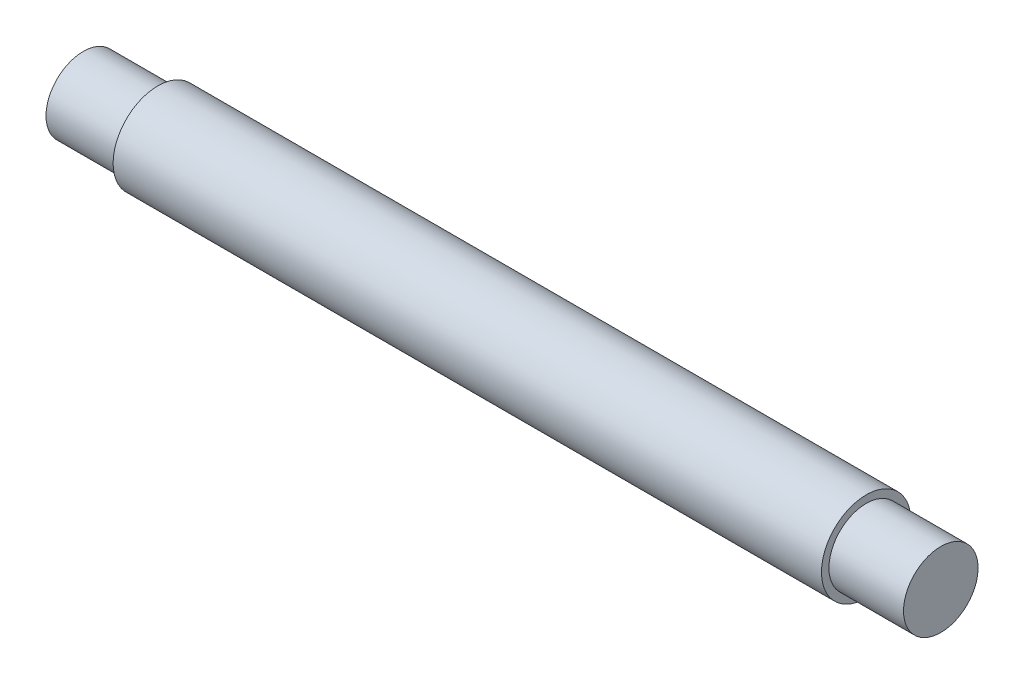
ISO-10303-21;
HEADER;
FILE_DESCRIPTION(('STEP AP214'),'2;1');
FILE_NAME('part.step','',(''),(''),'','','');
FILE_SCHEMA(('AUTOMOTIVE_DESIGN { 1 0 10303 214 1 1 1 1 }'));
ENDSEC;
DATA;
#1=APPLICATION_CONTEXT('core data for automotive mechanical design processes');
#2=APPLICATION_PROTOCOL_DEFINITION('international standard','automotive_design',2000,#1);
#3=PRODUCT_CONTEXT('',#1,'mechanical');
#4=PRODUCT('Part','Part','',(#3));
#5=PRODUCT_RELATED_PRODUCT_CATEGORY('part','',(#4));
#6=PRODUCT_DEFINITION_FORMATION('','',#4);
#7=PRODUCT_DEFINITION_CONTEXT('part definition',#1,'design');
#8=PRODUCT_DEFINITION('design','',#6,#7);
#9=PRODUCT_DEFINITION_SHAPE('','',#8);
#10=(LENGTH_UNIT() NAMED_UNIT(*) SI_UNIT(.MILLI.,.METRE.));
#11=(NAMED_UNIT(*) PLANE_ANGLE_UNIT() SI_UNIT($,.RADIAN.));
#12=(NAMED_UNIT(*) SI_UNIT($,.STERADIAN.) SOLID_ANGLE_UNIT());
#13=UNCERTAINTY_MEASURE_WITH_UNIT(LENGTH_MEASURE(1.E-05),#10,'distance_accuracy_value','');
#14=(GEOMETRIC_REPRESENTATION_CONTEXT(3) GLOBAL_UNCERTAINTY_ASSIGNED_CONTEXT((#13)) GLOBAL_UNIT_ASSIGNED_CONTEXT((#10,
#11,#12)) REPRESENTATION_CONTEXT('',''));
#15=CARTESIAN_POINT('',(0.,0.,0.));
#16=DIRECTION('',(0.,0.,1.));
#17=DIRECTION('',(1.,0.,0.));
#18=AXIS2_PLACEMENT_3D('',#15,#16,#17);
#19=CARTESIAN_POINT('',(115.,0.,0.));
#20=DIRECTION('',(-1.,0.,0.));
#21=DIRECTION('',(0.,0.,1.));
#22=AXIS2_PLACEMENT_3D('',#19,#20,#21);
#23=PLANE('',#22);
#24=CARTESIAN_POINT('',(115.,0.,0.));
#25=DIRECTION('',(-1.,0.,0.));
#26=DIRECTION('',(0.,0.,1.));
#27=AXIS2_PLACEMENT_3D('',#24,#25,#26);
#28=CIRCLE('',#27,5.00000000000001);
#29=CARTESIAN_POINT('',(115.,0.,5.00000000000001));
#30=VERTEX_POINT('',#29);
#31=EDGE_CURVE('E10',#30,#30,#28,.T.);
#32=ORIENTED_EDGE('',*,*,#31,.F.);
#33=EDGE_LOOP('',(#32));
#34=FACE_BOUND('',#33,.T.);
#35=ADVANCED_FACE('F36',(#34),#23,.F.);
#36=CARTESIAN_POINT('',(0.,0.,0.));
#37=DIRECTION('',(-1.,0.,0.));
#38=DIRECTION('',(0.,0.,1.));
#39=AXIS2_PLACEMENT_3D('',#36,#37,#38);
#40=CYLINDRICAL_SURFACE('',#39,5.00000000000001);
#41=CARTESIAN_POINT('',(105.,0.,0.));
#42=DIRECTION('',(-1.,0.,0.));
#43=DIRECTION('',(0.,0.,1.));
#44=AXIS2_PLACEMENT_3D('',#41,#42,#43);
#45=CIRCLE('',#44,5.00000000000001);
#46=CARTESIAN_POINT('',(105.,0.,5.00000000000001));
#47=VERTEX_POINT('',#46);
#48=EDGE_CURVE('E42',#47,#47,#45,.T.);
#49=ORIENTED_EDGE('',*,*,#48,.F.);
#50=EDGE_LOOP('',(#49));
#51=FACE_BOUND('',#50,.T.);
#52=ORIENTED_EDGE('',*,*,#31,.T.);
#53=EDGE_LOOP('',(#52));
#54=FACE_BOUND('',#53,.T.);
#55=ADVANCED_FACE('F84',(#51,#54),#40,.T.);
#56=CARTESIAN_POINT('',(105.,0.,-5.00000000000001));
#57=DIRECTION('',(-1.,0.,0.));
#58=DIRECTION('',(0.,0.,1.));
#59=AXIS2_PLACEMENT_3D('',#56,#57,#58);
#60=PLANE('',#59);
#61=CARTESIAN_POINT('',(105.,0.,0.));
#62=DIRECTION('',(-1.,0.,0.));
#63=DIRECTION('',(0.,0.,1.));
#64=AXIS2_PLACEMENT_3D('',#61,#62,#63);
#65=CIRCLE('',#64,6.);
#66=CARTESIAN_POINT('',(105.,0.,6.));
#67=VERTEX_POINT('',#66);
#68=EDGE_CURVE('E46',#67,#67,#65,.T.);
#69=ORIENTED_EDGE('',*,*,#68,.F.);
#70=EDGE_LOOP('',(#69));
#71=FACE_BOUND('',#70,.T.);
#72=ORIENTED_EDGE('',*,*,#48,.T.);
#73=EDGE_LOOP('',(#72));
#74=FACE_BOUND('',#73,.T.);
#75=ADVANCED_FACE('F79',(#71,#74),#60,.F.);
#76=CARTESIAN_POINT('',(0.,0.,0.));
#77=DIRECTION('',(-1.,0.,0.));
#78=DIRECTION('',(0.,0.,1.));
#79=AXIS2_PLACEMENT_3D('',#76,#77,#78);
#80=CYLINDRICAL_SURFACE('',#79,5.99999999999999);
#81=CARTESIAN_POINT('',(9.99999999999999,0.,0.));
#82=DIRECTION('',(-1.,0.,0.));
#83=DIRECTION('',(0.,0.,1.));
#84=AXIS2_PLACEMENT_3D('',#81,#82,#83);
#85=CIRCLE('',#84,5.99999999999999);
#86=CARTESIAN_POINT('',(9.99999999999999,0.,5.99999999999999));
#87=VERTEX_POINT('',#86);
#88=EDGE_CURVE('E50',#87,#87,#85,.T.);
#89=ORIENTED_EDGE('',*,*,#88,.F.);
#90=EDGE_LOOP('',(#89));
#91=FACE_BOUND('',#90,.T.);
#92=ORIENTED_EDGE('',*,*,#68,.T.);
#93=EDGE_LOOP('',(#92));
#94=FACE_BOUND('',#93,.T.);
#95=ADVANCED_FACE('F73',(#91,#94),#80,.T.);
#96=CARTESIAN_POINT('',(9.99999999999999,0.,-5.99999999999999));
#97=DIRECTION('',(1.,0.,0.));
#98=DIRECTION('',(0.,0.,-1.));
#99=AXIS2_PLACEMENT_3D('',#96,#97,#98);
#100=PLANE('',#99);
#101=CARTESIAN_POINT('',(9.99999999999999,0.,0.));
#102=DIRECTION('',(-1.,0.,0.));
#103=DIRECTION('',(0.,0.,1.));
#104=AXIS2_PLACEMENT_3D('',#101,#102,#103);
#105=CIRCLE('',#104,5.);
#106=CARTESIAN_POINT('',(9.99999999999999,0.,5.));
#107=VERTEX_POINT('',#106);
#108=EDGE_CURVE('E55',#107,#107,#105,.T.);
#109=ORIENTED_EDGE('',*,*,#108,.F.);
#110=EDGE_LOOP('',(#109));
#111=FACE_BOUND('',#110,.T.);
#112=ORIENTED_EDGE('',*,*,#88,.T.);
#113=EDGE_LOOP('',(#112));
#114=FACE_BOUND('',#113,.T.);
#115=ADVANCED_FACE('F67',(#111,#114),#100,.F.);
#116=CARTESIAN_POINT('',(0.,0.,0.));
#117=DIRECTION('',(-1.,0.,0.));
#118=DIRECTION('',(0.,0.,1.));
#119=AXIS2_PLACEMENT_3D('',#116,#117,#118);
#120=CYLINDRICAL_SURFACE('',#119,5.);
#121=CARTESIAN_POINT('',(0.,0.,0.));
#122=DIRECTION('',(-1.,0.,0.));
#123=DIRECTION('',(0.,0.,1.));
#124=AXIS2_PLACEMENT_3D('',#121,#122,#123);
#125=CIRCLE('',#124,5.);
#126=CARTESIAN_POINT('',(0.,0.,5.));
#127=VERTEX_POINT('',#126);
#128=EDGE_CURVE('E58',#127,#127,#125,.T.);
#129=ORIENTED_EDGE('',*,*,#128,.F.);
#130=EDGE_LOOP('',(#129));
#131=FACE_BOUND('',#130,.T.);
#132=ORIENTED_EDGE('',*,*,#108,.T.);
#133=EDGE_LOOP('',(#132));
#134=FACE_BOUND('',#133,.T.);
#135=ADVANCED_FACE('F64',(#131,#134),#120,.T.);
#136=CARTESIAN_POINT('',(0.,0.,-5.));
#137=DIRECTION('',(1.,0.,0.));
#138=DIRECTION('',(0.,0.,-1.));
#139=AXIS2_PLACEMENT_3D('',#136,#137,#138);
#140=PLANE('',#139);
#141=ORIENTED_EDGE('',*,*,#128,.T.);
#142=EDGE_LOOP('',(#141));
#143=FACE_BOUND('',#142,.T.);
#144=ADVANCED_FACE('F62',(#143),#140,.F.);
#145=CLOSED_SHELL('',(#35,#55,#75,#95,#115,#135,#144));
#146=MANIFOLD_SOLID_BREP('B2',#145);
#147=ADVANCED_BREP_SHAPE_REPRESENTATION('',(#18,#146),#14);
#148=SHAPE_DEFINITION_REPRESENTATION(#9,#147);
ENDSEC;
END-ISO-10303-21;
